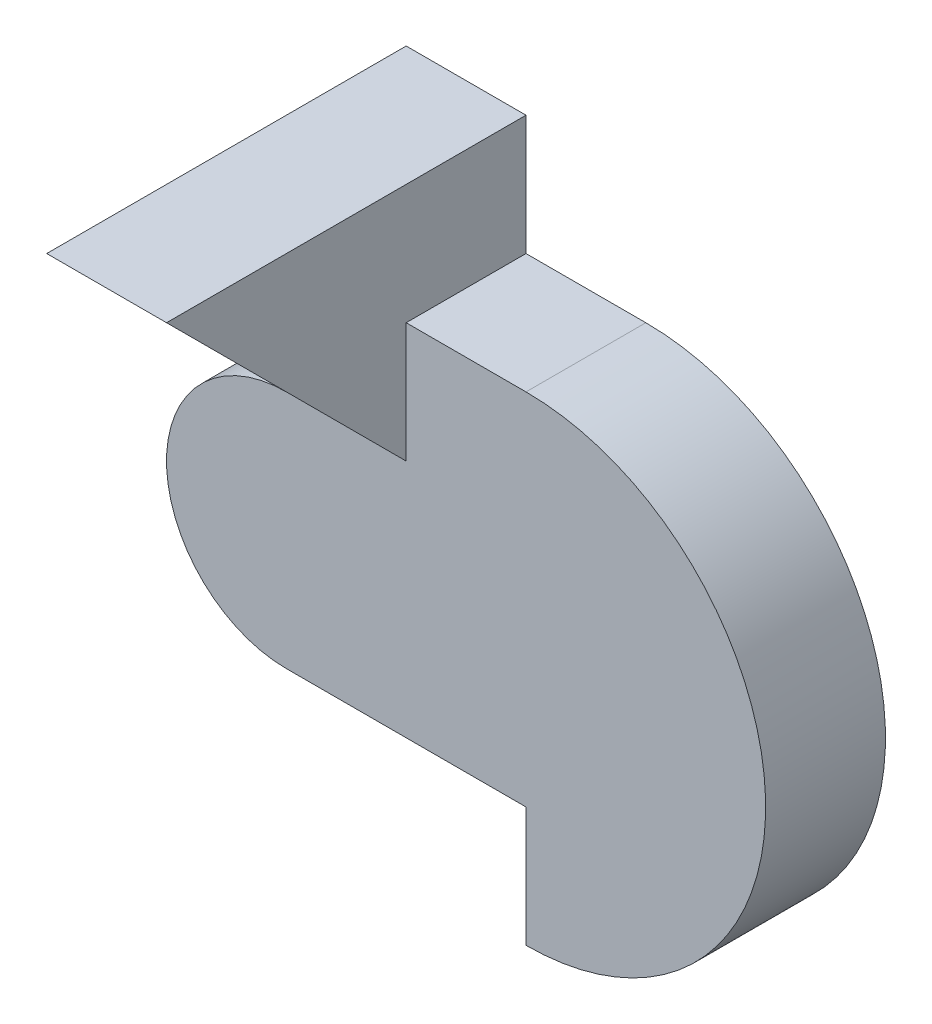
ISO-10303-21;
HEADER;
FILE_DESCRIPTION(('STEP AP214'),'2;1');
FILE_NAME('part.step','',(''),(''),'','','');
FILE_SCHEMA(('AUTOMOTIVE_DESIGN { 1 0 10303 214 1 1 1 1 }'));
ENDSEC;
DATA;
#1=APPLICATION_CONTEXT('core data for automotive mechanical design processes');
#2=APPLICATION_PROTOCOL_DEFINITION('international standard','automotive_design',2000,#1);
#3=PRODUCT_CONTEXT('',#1,'mechanical');
#4=PRODUCT('Part','Part','',(#3));
#5=PRODUCT_RELATED_PRODUCT_CATEGORY('part','',(#4));
#6=PRODUCT_DEFINITION_FORMATION('','',#4);
#7=PRODUCT_DEFINITION_CONTEXT('part definition',#1,'design');
#8=PRODUCT_DEFINITION('design','',#6,#7);
#9=PRODUCT_DEFINITION_SHAPE('','',#8);
#10=(LENGTH_UNIT() NAMED_UNIT(*) SI_UNIT(.MILLI.,.METRE.));
#11=(NAMED_UNIT(*) PLANE_ANGLE_UNIT() SI_UNIT($,.RADIAN.));
#12=(NAMED_UNIT(*) SI_UNIT($,.STERADIAN.) SOLID_ANGLE_UNIT());
#13=UNCERTAINTY_MEASURE_WITH_UNIT(LENGTH_MEASURE(1.E-05),#10,'distance_accuracy_value','');
#14=(GEOMETRIC_REPRESENTATION_CONTEXT(3) GLOBAL_UNCERTAINTY_ASSIGNED_CONTEXT((#13)) GLOBAL_UNIT_ASSIGNED_CONTEXT((#10,
#11,#12)) REPRESENTATION_CONTEXT('',''));
#15=CARTESIAN_POINT('',(0.,0.,0.));
#16=DIRECTION('',(0.,0.,1.));
#17=DIRECTION('',(1.,0.,0.));
#18=AXIS2_PLACEMENT_3D('',#15,#16,#17);
#19=CARTESIAN_POINT('',(0.,-10.,10.));
#20=DIRECTION('',(1.,0.,0.));
#21=DIRECTION('',(0.,1.,0.));
#22=AXIS2_PLACEMENT_3D('',#19,#20,#21);
#23=PLANE('',#22);
#24=DIRECTION('',(0.,-1.,0.));
#25=VECTOR('',#24,1.);
#26=CARTESIAN_POINT('',(0.,-10.,0.));
#27=LINE('',#26,#25);
#28=CARTESIAN_POINT('',(0.,-10.,0.));
#29=VERTEX_POINT('',#28);
#30=CARTESIAN_POINT('',(0.,-20.,0.));
#31=VERTEX_POINT('',#30);
#32=EDGE_CURVE('E143',#29,#31,#27,.T.);
#33=ORIENTED_EDGE('',*,*,#32,.T.);
#34=DIRECTION('',(0.,0.,-1.));
#35=VECTOR('',#34,1.);
#36=CARTESIAN_POINT('',(0.,-20.,10.));
#37=LINE('',#36,#35);
#38=CARTESIAN_POINT('',(0.,-20.,10.));
#39=VERTEX_POINT('',#38);
#40=EDGE_CURVE('E11',#39,#31,#37,.T.);
#41=ORIENTED_EDGE('',*,*,#40,.F.);
#42=DIRECTION('',(0.,-1.,0.));
#43=VECTOR('',#42,1.);
#44=CARTESIAN_POINT('',(0.,-10.,10.));
#45=LINE('',#44,#43);
#46=CARTESIAN_POINT('',(0.,-10.,10.));
#47=VERTEX_POINT('',#46);
#48=EDGE_CURVE('E157',#47,#39,#45,.T.);
#49=ORIENTED_EDGE('',*,*,#48,.F.);
#50=DIRECTION('',(0.,0.,-1.));
#51=VECTOR('',#50,1.);
#52=CARTESIAN_POINT('',(0.,-10.,10.));
#53=LINE('',#52,#51);
#54=EDGE_CURVE('E142',#47,#29,#53,.T.);
#55=ORIENTED_EDGE('',*,*,#54,.T.);
#56=EDGE_LOOP('',(#33,#41,#49,#55));
#57=FACE_BOUND('',#56,.T.);
#58=ADVANCED_FACE('F43',(#57),#23,.F.);
#59=CARTESIAN_POINT('',(0.,0.,10.));
#60=DIRECTION('',(0.,0.,-1.));
#61=DIRECTION('',(-1.,0.,0.));
#62=AXIS2_PLACEMENT_3D('',#59,#60,#61);
#63=CYLINDRICAL_SURFACE('',#62,20.);
#64=CARTESIAN_POINT('',(0.,0.,0.));
#65=DIRECTION('',(0.,0.,1.));
#66=DIRECTION('',(1.,0.,0.));
#67=AXIS2_PLACEMENT_3D('',#64,#65,#66);
#68=CIRCLE('',#67,20.);
#69=CARTESIAN_POINT('',(0.,20.,0.));
#70=VERTEX_POINT('',#69);
#71=EDGE_CURVE('E147',#31,#70,#68,.T.);
#72=ORIENTED_EDGE('',*,*,#71,.T.);
#73=DIRECTION('',(0.,0.,-1.));
#74=VECTOR('',#73,1.);
#75=CARTESIAN_POINT('',(0.,20.,10.));
#76=LINE('',#75,#74);
#77=CARTESIAN_POINT('',(0.,20.,10.));
#78=VERTEX_POINT('',#77);
#79=EDGE_CURVE('E52',#78,#70,#76,.T.);
#80=ORIENTED_EDGE('',*,*,#79,.F.);
#81=CARTESIAN_POINT('',(0.,0.,10.));
#82=DIRECTION('',(0.,0.,1.));
#83=DIRECTION('',(1.,0.,0.));
#84=AXIS2_PLACEMENT_3D('',#81,#82,#83);
#85=CIRCLE('',#84,20.);
#86=EDGE_CURVE('E95',#39,#78,#85,.T.);
#87=ORIENTED_EDGE('',*,*,#86,.F.);
#88=ORIENTED_EDGE('',*,*,#40,.T.);
#89=EDGE_LOOP('',(#72,#80,#87,#88));
#90=FACE_BOUND('',#89,.T.);
#91=ADVANCED_FACE('F225',(#90),#63,.T.);
#92=CARTESIAN_POINT('',(-9.99999999999993,20.,10.));
#93=DIRECTION('',(0.,-1.,0.));
#94=DIRECTION('',(0.,0.,-1.));
#95=AXIS2_PLACEMENT_3D('',#92,#93,#94);
#96=PLANE('',#95);
#97=DIRECTION('',(-1.,0.,0.));
#98=VECTOR('',#97,1.);
#99=CARTESIAN_POINT('',(-9.99999999999993,20.,0.));
#100=LINE('',#99,#98);
#101=CARTESIAN_POINT('',(-9.99999999999993,20.,0.));
#102=VERTEX_POINT('',#101);
#103=EDGE_CURVE('E118',#70,#102,#100,.T.);
#104=ORIENTED_EDGE('',*,*,#103,.T.);
#105=DIRECTION('',(0.,0.,-1.));
#106=VECTOR('',#105,1.);
#107=CARTESIAN_POINT('',(-9.99999999999993,20.,10.));
#108=LINE('',#107,#106);
#109=CARTESIAN_POINT('',(-9.99999999999993,20.,10.));
#110=VERTEX_POINT('',#109);
#111=EDGE_CURVE('E115',#110,#102,#108,.T.);
#112=ORIENTED_EDGE('',*,*,#111,.F.);
#113=DIRECTION('',(-1.,0.,0.));
#114=VECTOR('',#113,1.);
#115=CARTESIAN_POINT('',(-9.99999999999993,20.,10.));
#116=LINE('',#115,#114);
#117=EDGE_CURVE('E103',#78,#110,#116,.T.);
#118=ORIENTED_EDGE('',*,*,#117,.F.);
#119=ORIENTED_EDGE('',*,*,#79,.T.);
#120=EDGE_LOOP('',(#104,#112,#118,#119));
#121=FACE_BOUND('',#120,.T.);
#122=ADVANCED_FACE('F116',(#121),#96,.F.);
#123=CARTESIAN_POINT('',(-20.,0.,10.));
#124=DIRECTION('',(0.,0.,-1.));
#125=DIRECTION('',(-1.,0.,0.));
#126=AXIS2_PLACEMENT_3D('',#123,#124,#125);
#127=CYLINDRICAL_SURFACE('',#126,10.);
#128=CARTESIAN_POINT('',(-20.,0.,0.));
#129=DIRECTION('',(0.,0.,1.));
#130=DIRECTION('',(-1.,0.,0.));
#131=AXIS2_PLACEMENT_3D('',#128,#129,#130);
#132=CIRCLE('',#131,10.);
#133=CARTESIAN_POINT('',(-20.,10.,0.));
#134=VERTEX_POINT('',#133);
#135=CARTESIAN_POINT('',(-20.,-10.,0.));
#136=VERTEX_POINT('',#135);
#137=EDGE_CURVE('E81',#134,#136,#132,.T.);
#138=ORIENTED_EDGE('',*,*,#137,.T.);
#139=DIRECTION('',(0.,0.,-1.));
#140=VECTOR('',#139,1.);
#141=CARTESIAN_POINT('',(-20.,-10.,10.));
#142=LINE('',#141,#140);
#143=CARTESIAN_POINT('',(-20.,-10.,10.));
#144=VERTEX_POINT('',#143);
#145=EDGE_CURVE('E160',#144,#136,#142,.T.);
#146=ORIENTED_EDGE('',*,*,#145,.F.);
#147=CARTESIAN_POINT('',(-19.9999999999999,0.,10.));
#148=DIRECTION('',(0.,0.,1.));
#149=DIRECTION('',(-1.,0.,0.));
#150=AXIS2_PLACEMENT_3D('',#147,#148,#149);
#151=CIRCLE('',#150,10.);
#152=CARTESIAN_POINT('',(-20.,10.,10.));
#153=VERTEX_POINT('',#152);
#154=EDGE_CURVE('E134',#153,#144,#151,.T.);
#155=ORIENTED_EDGE('',*,*,#154,.F.);
#156=DIRECTION('',(0.,0.,-1.));
#157=VECTOR('',#156,1.);
#158=CARTESIAN_POINT('',(-19.9999999999999,10.,10.));
#159=LINE('',#158,#157);
#160=EDGE_CURVE('E123',#153,#134,#159,.T.);
#161=ORIENTED_EDGE('',*,*,#160,.T.);
#162=EDGE_LOOP('',(#138,#146,#155,#161));
#163=FACE_BOUND('',#162,.T.);
#164=ADVANCED_FACE('F220',(#163),#127,.T.);
#165=CARTESIAN_POINT('',(0.,-10.,10.));
#166=DIRECTION('',(0.,1.,0.));
#167=DIRECTION('',(-1.,0.,0.));
#168=AXIS2_PLACEMENT_3D('',#165,#166,#167);
#169=PLANE('',#168);
#170=DIRECTION('',(1.,0.,0.));
#171=VECTOR('',#170,1.);
#172=CARTESIAN_POINT('',(0.,-10.,0.));
#173=LINE('',#172,#171);
#174=EDGE_CURVE('E87',#136,#29,#173,.T.);
#175=ORIENTED_EDGE('',*,*,#174,.T.);
#176=ORIENTED_EDGE('',*,*,#54,.F.);
#177=DIRECTION('',(1.,0.,0.));
#178=VECTOR('',#177,1.);
#179=CARTESIAN_POINT('',(0.,-10.,10.));
#180=LINE('',#179,#178);
#181=EDGE_CURVE('E60',#144,#47,#180,.T.);
#182=ORIENTED_EDGE('',*,*,#181,.F.);
#183=ORIENTED_EDGE('',*,*,#145,.T.);
#184=EDGE_LOOP('',(#175,#176,#182,#183));
#185=FACE_BOUND('',#184,.T.);
#186=ADVANCED_FACE('F221',(#185),#169,.F.);
#187=CARTESIAN_POINT('',(0.,0.,10.));
#188=DIRECTION('',(0.,0.,1.));
#189=DIRECTION('',(1.,0.,0.));
#190=AXIS2_PLACEMENT_3D('',#187,#188,#189);
#191=PLANE('',#190);
#192=ORIENTED_EDGE('',*,*,#48,.T.);
#193=ORIENTED_EDGE('',*,*,#86,.T.);
#194=ORIENTED_EDGE('',*,*,#117,.T.);
#195=DIRECTION('',(0.,-1.,0.));
#196=VECTOR('',#195,1.);
#197=CARTESIAN_POINT('',(-9.99999999999993,10.,10.));
#198=LINE('',#197,#196);
#199=CARTESIAN_POINT('',(-9.99999999999993,10.,10.));
#200=VERTEX_POINT('',#199);
#201=EDGE_CURVE('E109',#110,#200,#198,.T.);
#202=ORIENTED_EDGE('',*,*,#201,.T.);
#203=DIRECTION('',(-1.,0.,0.));
#204=VECTOR('',#203,1.);
#205=CARTESIAN_POINT('',(-19.9999999999999,10.,10.));
#206=LINE('',#205,#204);
#207=EDGE_CURVE('E131',#200,#153,#206,.T.);
#208=ORIENTED_EDGE('',*,*,#207,.T.);
#209=ORIENTED_EDGE('',*,*,#154,.T.);
#210=ORIENTED_EDGE('',*,*,#181,.T.);
#211=EDGE_LOOP('',(#192,#193,#194,#202,#208,#209,#210));
#212=FACE_BOUND('',#211,.T.);
#213=ADVANCED_FACE('F105',(#212),#191,.T.);
#214=CARTESIAN_POINT('',(0.,0.,0.));
#215=DIRECTION('',(0.,0.,1.));
#216=DIRECTION('',(1.,0.,0.));
#217=AXIS2_PLACEMENT_3D('',#214,#215,#216);
#218=PLANE('',#217);
#219=ORIENTED_EDGE('',*,*,#32,.F.);
#220=ORIENTED_EDGE('',*,*,#174,.F.);
#221=ORIENTED_EDGE('',*,*,#137,.F.);
#222=DIRECTION('',(0.,-1.,0.));
#223=VECTOR('',#222,1.);
#224=CARTESIAN_POINT('',(-20.,10.,0.));
#225=LINE('',#224,#223);
#226=CARTESIAN_POINT('',(-20.,30.,0.));
#227=VERTEX_POINT('',#226);
#228=EDGE_CURVE('E180',#227,#134,#225,.T.);
#229=ORIENTED_EDGE('',*,*,#228,.F.);
#230=DIRECTION('',(-1.,0.,0.));
#231=VECTOR('',#230,1.);
#232=CARTESIAN_POINT('',(-20.,30.,0.));
#233=LINE('',#232,#231);
#234=CARTESIAN_POINT('',(-9.99999999999993,30.,0.));
#235=VERTEX_POINT('',#234);
#236=EDGE_CURVE('E173',#235,#227,#233,.T.);
#237=ORIENTED_EDGE('',*,*,#236,.F.);
#238=DIRECTION('',(0.,1.,0.));
#239=VECTOR('',#238,1.);
#240=CARTESIAN_POINT('',(-9.99999999999993,30.,0.));
#241=LINE('',#240,#239);
#242=EDGE_CURVE('E169',#102,#235,#241,.T.);
#243=ORIENTED_EDGE('',*,*,#242,.F.);
#244=ORIENTED_EDGE('',*,*,#103,.F.);
#245=ORIENTED_EDGE('',*,*,#71,.F.);
#246=EDGE_LOOP('',(#219,#220,#221,#229,#237,#243,#244,#245));
#247=FACE_BOUND('',#246,.T.);
#248=ADVANCED_FACE('F167',(#247),#218,.F.);
#249=CARTESIAN_POINT('',(-9.99999999999993,30.,30.));
#250=DIRECTION('',(-1.,0.,0.));
#251=DIRECTION('',(0.,-1.,0.));
#252=AXIS2_PLACEMENT_3D('',#249,#250,#251);
#253=PLANE('',#252);
#254=DIRECTION('',(0.,0.,-1.));
#255=VECTOR('',#254,1.);
#256=CARTESIAN_POINT('',(-9.99999999999993,30.,30.));
#257=LINE('',#256,#255);
#258=CARTESIAN_POINT('',(-9.99999999999993,30.,30.));
#259=VERTEX_POINT('',#258);
#260=EDGE_CURVE('E148',#259,#235,#257,.T.);
#261=ORIENTED_EDGE('',*,*,#260,.F.);
#262=DIRECTION('',(0.,0.707106781186548,0.707106781186548));
#263=VECTOR('',#262,1.);
#264=CARTESIAN_POINT('',(-9.99999999999993,10.,10.));
#265=LINE('',#264,#263);
#266=EDGE_CURVE('E129',#200,#259,#265,.T.);
#267=ORIENTED_EDGE('',*,*,#266,.F.);
#268=ORIENTED_EDGE('',*,*,#201,.F.);
#269=ORIENTED_EDGE('',*,*,#111,.T.);
#270=ORIENTED_EDGE('',*,*,#242,.T.);
#271=EDGE_LOOP('',(#261,#267,#268,#269,#270));
#272=FACE_BOUND('',#271,.T.);
#273=ADVANCED_FACE('F127',(#272),#253,.F.);
#274=CARTESIAN_POINT('',(-20.,30.,30.));
#275=DIRECTION('',(0.,-1.,0.));
#276=DIRECTION('',(0.,0.,-1.));
#277=AXIS2_PLACEMENT_3D('',#274,#275,#276);
#278=PLANE('',#277);
#279=ORIENTED_EDGE('',*,*,#236,.T.);
#280=DIRECTION('',(0.,0.,-1.));
#281=VECTOR('',#280,1.);
#282=CARTESIAN_POINT('',(-20.,30.,30.));
#283=LINE('',#282,#281);
#284=CARTESIAN_POINT('',(-20.,30.,30.));
#285=VERTEX_POINT('',#284);
#286=EDGE_CURVE('E190',#285,#227,#283,.T.);
#287=ORIENTED_EDGE('',*,*,#286,.F.);
#288=DIRECTION('',(-1.,0.,0.));
#289=VECTOR('',#288,1.);
#290=CARTESIAN_POINT('',(-20.,30.,30.));
#291=LINE('',#290,#289);
#292=EDGE_CURVE('E185',#259,#285,#291,.T.);
#293=ORIENTED_EDGE('',*,*,#292,.F.);
#294=ORIENTED_EDGE('',*,*,#260,.T.);
#295=EDGE_LOOP('',(#279,#287,#293,#294));
#296=FACE_BOUND('',#295,.T.);
#297=ADVANCED_FACE('F214',(#296),#278,.F.);
#298=CARTESIAN_POINT('',(-20.,10.,30.));
#299=DIRECTION('',(1.,0.,0.));
#300=DIRECTION('',(0.,1.,0.));
#301=AXIS2_PLACEMENT_3D('',#298,#299,#300);
#302=PLANE('',#301);
#303=ORIENTED_EDGE('',*,*,#160,.F.);
#304=DIRECTION('',(0.,0.707106781186548,0.707106781186548));
#305=VECTOR('',#304,1.);
#306=CARTESIAN_POINT('',(-20.,20.,20.));
#307=LINE('',#306,#305);
#308=EDGE_CURVE('E176',#153,#285,#307,.T.);
#309=ORIENTED_EDGE('',*,*,#308,.T.);
#310=ORIENTED_EDGE('',*,*,#286,.T.);
#311=ORIENTED_EDGE('',*,*,#228,.T.);
#312=EDGE_LOOP('',(#303,#309,#310,#311));
#313=FACE_BOUND('',#312,.T.);
#314=ADVANCED_FACE('F212',(#313),#302,.F.);
#315=CARTESIAN_POINT('',(-39.9999999999999,10.,10.));
#316=DIRECTION('',(0.,0.707106781186547,-0.707106781186547));
#317=DIRECTION('',(0.,0.707106781186548,0.707106781186548));
#318=AXIS2_PLACEMENT_3D('',#315,#316,#317);
#319=PLANE('',#318);
#320=ORIENTED_EDGE('',*,*,#207,.F.);
#321=ORIENTED_EDGE('',*,*,#266,.T.);
#322=ORIENTED_EDGE('',*,*,#292,.T.);
#323=ORIENTED_EDGE('',*,*,#308,.F.);
#324=EDGE_LOOP('',(#320,#321,#322,#323));
#325=FACE_BOUND('',#324,.T.);
#326=ADVANCED_FACE('F205',(#325),#319,.F.);
#327=CLOSED_SHELL('',(#58,#91,#122,#164,#186,#213,#248,#273,#297,#314,#326));
#328=MANIFOLD_SOLID_BREP('B2',#327);
#329=ADVANCED_BREP_SHAPE_REPRESENTATION('',(#18,#328),#14);
#330=SHAPE_DEFINITION_REPRESENTATION(#9,#329);
ENDSEC;
END-ISO-10303-21;
